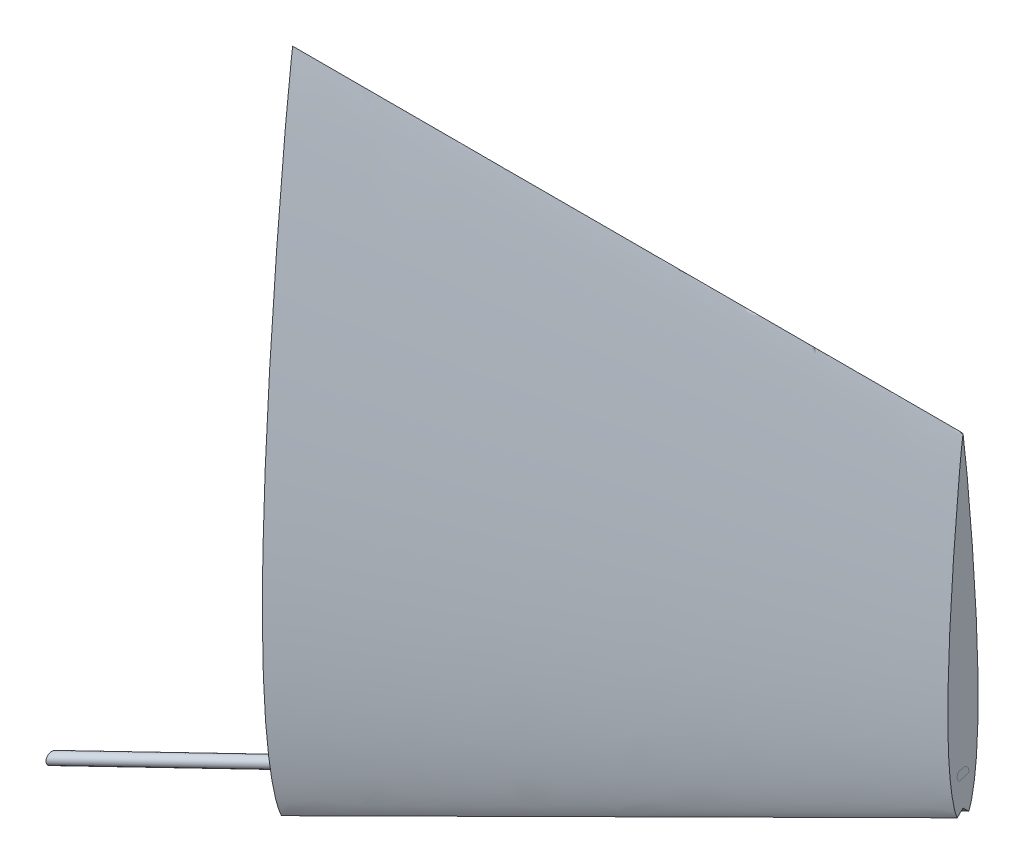
ISO-10303-21;
HEADER;
FILE_DESCRIPTION(('STEP AP214'),'2;1');
FILE_NAME('part.step','',(''),(''),'','','');
FILE_SCHEMA(('AUTOMOTIVE_DESIGN { 1 0 10303 214 1 1 1 1 }'));
ENDSEC;
DATA;
#1=APPLICATION_CONTEXT('core data for automotive mechanical design processes');
#2=APPLICATION_PROTOCOL_DEFINITION('international standard','automotive_design',2000,#1);
#3=PRODUCT_CONTEXT('',#1,'mechanical');
#4=PRODUCT('Part','Part','',(#3));
#5=PRODUCT_RELATED_PRODUCT_CATEGORY('part','',(#4));
#6=PRODUCT_DEFINITION_FORMATION('','',#4);
#7=PRODUCT_DEFINITION_CONTEXT('part definition',#1,'design');
#8=PRODUCT_DEFINITION('design','',#6,#7);
#9=PRODUCT_DEFINITION_SHAPE('','',#8);
#10=(LENGTH_UNIT() NAMED_UNIT(*) SI_UNIT(.MILLI.,.METRE.));
#11=(NAMED_UNIT(*) PLANE_ANGLE_UNIT() SI_UNIT($,.RADIAN.));
#12=(NAMED_UNIT(*) SI_UNIT($,.STERADIAN.) SOLID_ANGLE_UNIT());
#13=UNCERTAINTY_MEASURE_WITH_UNIT(LENGTH_MEASURE(1.E-05),#10,'distance_accuracy_value','');
#14=(GEOMETRIC_REPRESENTATION_CONTEXT(3) GLOBAL_UNCERTAINTY_ASSIGNED_CONTEXT((#13)) GLOBAL_UNIT_ASSIGNED_CONTEXT((#10,
#11,#12)) REPRESENTATION_CONTEXT('',''));
#15=CARTESIAN_POINT('',(0.,0.,0.));
#16=DIRECTION('',(0.,0.,1.));
#17=DIRECTION('',(1.,0.,0.));
#18=AXIS2_PLACEMENT_3D('',#15,#16,#17);
#19=CARTESIAN_POINT('',(-20.4751650397172,51.7442420315947,0.));
#20=DIRECTION('',(1.,0.,0.));
#21=DIRECTION('',(0.,0.,-1.));
#22=AXIS2_PLACEMENT_3D('',#19,#20,#21);
#23=PLANE('',#22);
#24=CARTESIAN_POINT('',(-20.4751650397172,51.7442420315947,0.));
#25=DIRECTION('',(1.,0.,0.));
#26=DIRECTION('',(0.,0.,-1.));
#27=AXIS2_PLACEMENT_3D('',#24,#25,#26);
#28=CIRCLE('',#27,0.5);
#29=CARTESIAN_POINT('',(-20.4751650397172,51.7442420315947,-0.5));
#30=VERTEX_POINT('',#29);
#31=EDGE_CURVE('E65',#30,#30,#28,.T.);
#32=ORIENTED_EDGE('',*,*,#31,.F.);
#33=EDGE_LOOP('',(#32));
#34=FACE_BOUND('',#33,.T.);
#35=ADVANCED_FACE('F59',(#34),#23,.F.);
#36=CARTESIAN_POINT('',(57.,89.3,0.));
#37=DIRECTION('',(1.,0.,0.));
#38=DIRECTION('',(0.,0.,-1.));
#39=AXIS2_PLACEMENT_3D('',#36,#37,#38);
#40=PLANE('',#39);
#41=CARTESIAN_POINT('',(57.,89.3,0.));
#42=DIRECTION('',(1.,0.,0.));
#43=DIRECTION('',(0.,0.,-1.));
#44=AXIS2_PLACEMENT_3D('',#41,#42,#43);
#45=CIRCLE('',#44,0.5);
#46=CARTESIAN_POINT('',(57.,89.3,-0.5));
#47=VERTEX_POINT('',#46);
#48=EDGE_CURVE('E12',#47,#47,#45,.T.);
#49=ORIENTED_EDGE('',*,*,#48,.T.);
#50=EDGE_LOOP('',(#49));
#51=FACE_BOUND('',#50,.T.);
#52=ADVANCED_FACE('F74',(#51),#40,.T.);
#53=CARTESIAN_POINT('',(-20.4751650397172,51.7442420315947,-0.5));
#54=CARTESIAN_POINT('',(57.,89.3,-0.5));
#55=CARTESIAN_POINT('',(-20.4751650397172,52.7442420315947,-0.5));
#56=CARTESIAN_POINT('',(57.,90.3,-0.5));
#57=CARTESIAN_POINT('',(-20.4751650397172,52.7442420315947,0.5));
#58=CARTESIAN_POINT('',(57.,90.3,0.5));
#59=CARTESIAN_POINT('',(-20.4751650397172,51.7442420315947,0.5));
#60=CARTESIAN_POINT('',(57.,89.3,0.5));
#61=CARTESIAN_POINT('',(-20.4751650397172,50.7442420315947,0.5));
#62=CARTESIAN_POINT('',(57.,88.3,0.5));
#63=CARTESIAN_POINT('',(-20.4751650397172,50.7442420315947,-0.5));
#64=CARTESIAN_POINT('',(57.,88.3,-0.5));
#65=CARTESIAN_POINT('',(-20.4751650397172,51.7442420315947,-0.5));
#66=CARTESIAN_POINT('',(57.,89.3,-0.5));
#67=(BOUNDED_SURFACE() B_SPLINE_SURFACE(3,1,((#53,#54),(#55,#56),(#57,#58),(#59,#60),(#61,#62),
(#63,#64),(#65,#66)),.UNSPECIFIED.,.T.,.F.,.F.) B_SPLINE_SURFACE_WITH_KNOTS((4,3,4),(2,2),(0.,
0.5,1.),(0.,1.),.UNSPECIFIED.) GEOMETRIC_REPRESENTATION_ITEM() RATIONAL_B_SPLINE_SURFACE(((1.,
1.),(0.333333333333333,0.333333333333333),(0.333333333333333,0.333333333333333),(1.,1.),
(0.333333333333333,0.333333333333333),(0.333333333333333,0.333333333333333),(1.,1.))) REPRESENTATION_ITEM('') SURFACE());
#68=CARTESIAN_POINT('',(57.,89.3,-0.5));
#69=CARTESIAN_POINT('',(56.1929670308363,88.9087941878292,-0.5));
#70=CARTESIAN_POINT('',(55.3859340616726,88.5175883756583,-0.5));
#71=CARTESIAN_POINT('',(53.7718681233452,87.7351767513165,-0.5));
#72=CARTESIAN_POINT('',(52.9648351541814,87.3439709391456,-0.5));
#73=CARTESIAN_POINT('',(51.350769215854,86.5615593148038,-0.5));
#74=CARTESIAN_POINT('',(50.5437362466903,86.1703535026329,-0.5));
#75=CARTESIAN_POINT('',(48.9296703083628,85.3879418782912,-0.5));
#76=CARTESIAN_POINT('',(48.1226373391991,84.9967360661203,-0.5));
#77=CARTESIAN_POINT('',(46.5085714008716,84.2143244417785,-0.5));
#78=CARTESIAN_POINT('',(45.7015384317079,83.8231186296076,-0.5));
#79=CARTESIAN_POINT('',(44.0874724933805,83.0407070052658,-0.5));
#80=CARTESIAN_POINT('',(43.2804395242168,82.6495011930949,-0.5));
#81=CARTESIAN_POINT('',(41.6663735858893,81.8670895687532,-0.5));
#82=CARTESIAN_POINT('',(40.8593406167256,81.4758837565823,-0.5));
#83=CARTESIAN_POINT('',(39.2452746783982,80.6934721322405,-0.5));
#84=CARTESIAN_POINT('',(38.4382417092344,80.3022663200696,-0.5));
#85=CARTESIAN_POINT('',(36.824175770907,79.5198546957278,-0.5));
#86=CARTESIAN_POINT('',(36.0171428017433,79.1286488835569,-0.5));
#87=CARTESIAN_POINT('',(34.4030768634158,78.3462372592151,-0.5));
#88=CARTESIAN_POINT('',(33.5960438942521,77.9550314470443,-0.5));
#89=CARTESIAN_POINT('',(31.9819779559247,77.1726198227025,-0.5));
#90=CARTESIAN_POINT('',(31.1749449867609,76.7814140105316,-0.5));
#91=CARTESIAN_POINT('',(29.5608790484335,75.9990023861898,-0.5));
#92=CARTESIAN_POINT('',(28.7538460792698,75.6077965740189,-0.5));
#93=CARTESIAN_POINT('',(27.1397801409423,74.8253849496772,-0.5));
#94=CARTESIAN_POINT('',(26.3327471717786,74.4341791375063,-0.5));
#95=CARTESIAN_POINT('',(24.7186812334512,73.6517675131645,-0.5));
#96=CARTESIAN_POINT('',(23.9116482642874,73.2605617009936,-0.5));
#97=CARTESIAN_POINT('',(22.29758232596,72.4781500766518,-0.5));
#98=CARTESIAN_POINT('',(21.4905493567963,72.0869442644809,-0.5));
#99=CARTESIAN_POINT('',(19.8764834184688,71.3045326401392,-0.5));
#100=CARTESIAN_POINT('',(19.0694504493051,70.9133268279683,-0.5));
#101=CARTESIAN_POINT('',(17.4553845109777,70.1309152036265,-0.5));
#102=CARTESIAN_POINT('',(16.648351541814,69.7397093914556,-0.5));
#103=CARTESIAN_POINT('',(15.0342856034865,68.9572977671138,-0.5));
#104=CARTESIAN_POINT('',(14.2272526343228,68.5660919549429,-0.5));
#105=CARTESIAN_POINT('',(12.6131866959953,67.7836803306012,-0.5));
#106=CARTESIAN_POINT('',(11.8061537268316,67.3924745184303,-0.5));
#107=CARTESIAN_POINT('',(10.1920877885042,66.6100628940885,-0.5));
#108=CARTESIAN_POINT('',(9.38505481934046,66.2188570819176,-0.5));
#109=CARTESIAN_POINT('',(7.77098888101302,65.4364454575758,-0.5));
#110=CARTESIAN_POINT('',(6.9639559118493,65.0452396454049,-0.5));
#111=CARTESIAN_POINT('',(5.34988997352185,64.2628280210631,-0.5));
#112=CARTESIAN_POINT('',(4.54285700435813,63.8716222088923,-0.5));
#113=CARTESIAN_POINT('',(2.92879106603068,63.0892105845505,-0.5));
#114=CARTESIAN_POINT('',(2.12175809686696,62.6980047723796,-0.5));
#115=CARTESIAN_POINT('',(0.50769215853952,61.9155931480378,-0.5));
#116=CARTESIAN_POINT('',(-0.2993408106242,61.5243873358669,-0.5));
#117=CARTESIAN_POINT('',(-1.91340674895164,60.7419757115251,-0.5));
#118=CARTESIAN_POINT('',(-2.72043971811537,60.3507698993543,-0.5));
#119=CARTESIAN_POINT('',(-4.33450565644281,59.5683582750125,-0.5));
#120=CARTESIAN_POINT('',(-5.14153862560653,59.1771524628416,-0.5));
#121=CARTESIAN_POINT('',(-6.75560456393397,58.3947408384998,-0.5));
#122=CARTESIAN_POINT('',(-7.56263753309769,58.0035350263289,-0.5));
#123=CARTESIAN_POINT('',(-9.17670347142514,57.2211234019871,-0.5));
#124=CARTESIAN_POINT('',(-9.98373644058886,56.8299175898163,-0.5));
#125=CARTESIAN_POINT('',(-11.5978023789163,56.0475059654745,-0.5));
#126=CARTESIAN_POINT('',(-12.40483534808,55.6563001533036,-0.5));
#127=CARTESIAN_POINT('',(-14.0189012864075,54.8738885289618,-0.5));
#128=CARTESIAN_POINT('',(-14.8259342555712,54.4826827167909,-0.5));
#129=CARTESIAN_POINT('',(-16.4400001938986,53.7002710924492,-0.5));
#130=CARTESIAN_POINT('',(-17.2470331630624,53.3090652802783,-0.5));
#131=CARTESIAN_POINT('',(-18.8610991013898,52.5266536559365,-0.5));
#132=CARTESIAN_POINT('',(-19.6681320705535,52.1354478437656,-0.5));
#133=CARTESIAN_POINT('',(-20.4751650397172,51.7442420315947,-0.5));
#134=B_SPLINE_CURVE_WITH_KNOTS('',3,(#68,#69,#70,#71,#72,#73,#74,#75,#76,#77,#78,#79,#80,#81,
#82,#83,#84,#85,#86,#87,#88,#89,#90,#91,#92,#93,#94,#95,#96,#97,#98,#99,#100,#101,#102,#103,
#104,#105,#106,#107,#108,#109,#110,#111,#112,#113,#114,#115,#116,#117,#118,#119,#120,#121,#122,
#123,#124,#125,#126,#127,#128,#129,#130,#131,#132,#133),.UNSPECIFIED.,.F.,.F.,(4,2,2,2,2,2,2,2,
2,2,2,2,2,2,2,2,2,2,2,2,2,2,2,2,2,2,2,2,2,2,2,2,4),(0.,2.69055715552402,5.38111431104803,
8.07167146657204,10.7622286220961,13.4527857776201,16.1433429331441,18.8339000886681,
21.5244572441921,24.2150143997161,26.9055715552401,29.5961287107641,32.2866858662882,
34.9772430218122,37.6678001773362,40.3583573328602,43.0489144883842,45.7394716439082,
48.4300287994323,51.1205859549563,53.8111431104803,56.5017002660043,59.1922574215283,
61.8828145770523,64.5733717325763,67.2639288881003,69.9544860436244,72.6450431991484,
75.3356003546724,78.0261575101964,80.7167146657204,83.4072718212444,86.0978289767685),.UNSPECIFIED.);
#135=EDGE_CURVE('BSEAM71',#47,#30,#134,.T.);
#136=ORIENTED_EDGE('',*,*,#48,.F.);
#137=ORIENTED_EDGE('',*,*,#31,.T.);
#138=ORIENTED_EDGE('',*,*,#135,.T.);
#139=ORIENTED_EDGE('',*,*,#135,.F.);
#140=EDGE_LOOP('',(#136,#138,#137,#139));
#141=FACE_BOUND('',#140,.T.);
#142=ADVANCED_FACE('F71',(#141),#67,.T.);
#143=CLOSED_SHELL('',(#35,#52,#142));
#144=MANIFOLD_SOLID_BREP('B2',#143);
#145=CARTESIAN_POINT('',(57.,114.4,0.));
#146=CARTESIAN_POINT('',(0.,114.4,0.));
#147=CARTESIAN_POINT('',(57.,114.4,-0.00182095810749763));
#148=CARTESIAN_POINT('',(0.,114.4,-0.00364191621499526));
#149=CARTESIAN_POINT('',(57.,114.352907672617,-0.00546220916385912));
#150=CARTESIAN_POINT('',(0.,114.305815345234,-0.0109244183277182));
#151=CARTESIAN_POINT('',(57.,114.32002966172,-0.0109070616915182));
#152=CARTESIAN_POINT('',(0.,114.240059323441,-0.0218141233830365));
#153=CARTESIAN_POINT('',(57.,114.249222738711,-0.0198785714299646));
#154=CARTESIAN_POINT('',(0.,114.098445477423,-0.0397571428599293));
#155=CARTESIAN_POINT('',(57.,114.156548337744,-0.032132456041945));
#156=CARTESIAN_POINT('',(0.,113.913096675488,-0.0642649120838899));
#157=CARTESIAN_POINT('',(57.,114.034213823481,-0.0474417351200506));
#158=CARTESIAN_POINT('',(0.,113.668427646962,-0.0948834702401012));
#159=CARTESIAN_POINT('',(57.,113.886541749933,-0.0656072474393022));
#160=CARTESIAN_POINT('',(0.,113.373083499866,-0.131214494878604));
#161=CARTESIAN_POINT('',(57.,113.370012426993,-0.127548617429597));
#162=CARTESIAN_POINT('',(0.,112.340024853985,-0.255097234859193));
#163=CARTESIAN_POINT('',(57.,112.137163028017,-0.259027461460315));
#164=CARTESIAN_POINT('',(0.,109.874326056035,-0.51805492292063));
#165=CARTESIAN_POINT('',(57.,110.501004902275,-0.411740073326686));
#166=CARTESIAN_POINT('',(0.,106.60200980455,-0.823480146653373));
#167=CARTESIAN_POINT('',(57.,108.197187000479,-0.60964155845022));
#168=CARTESIAN_POINT('',(0.,101.994374000957,-1.21928311690044));
#169=CARTESIAN_POINT('',(57.,105.44956023543,-0.82314706743673));
#170=CARTESIAN_POINT('',(0.,96.4991204708607,-1.64629413487346));
#171=CARTESIAN_POINT('',(57.,101.925918142368,-1.05329602538316));
#172=CARTESIAN_POINT('',(0.,89.4518362847364,-2.10659205076633));
#173=CARTESIAN_POINT('',(57.0000000000001,98.2774944583724,-1.22854383866665));
#174=CARTESIAN_POINT('',(0.,82.1549889167448,-2.45708767733329));
#175=CARTESIAN_POINT('',(57.,95.5458702597783,-1.29200246249632));
#176=CARTESIAN_POINT('',(0.,76.6917405195566,-2.58400492499264));
#177=CARTESIAN_POINT('',(57.,93.7843198333664,-1.28990739427786));
#178=CARTESIAN_POINT('',(0.,73.1686396667328,-2.57981478855572));
#179=CARTESIAN_POINT('',(57.,92.7064529548784,-1.27556105945408));
#180=CARTESIAN_POINT('',(0.,71.0129059097568,-2.55112211890817));
#181=CARTESIAN_POINT('',(57.,91.4434168803456,-1.23757411909588));
#182=CARTESIAN_POINT('',(0.,68.4868337606911,-2.47514823819176));
#183=CARTESIAN_POINT('',(57.,89.8610871222189,-1.14403607707087));
#184=CARTESIAN_POINT('',(0.,65.3221742444376,-2.28807215414174));
#185=CARTESIAN_POINT('',(56.9999999999999,88.6339594379661,-1.01587816182833));
#186=CARTESIAN_POINT('',(0.,62.8679188759322,-2.03175632365666));
#187=CARTESIAN_POINT('',(57.,87.7322213407688,-0.870007471666012));
#188=CARTESIAN_POINT('',(0.,61.0644426815377,-1.74001494333202));
#189=CARTESIAN_POINT('',(57.,87.291174629283,-0.784346378199465));
#190=CARTESIAN_POINT('',(0.,60.1823492585658,-1.56869275639893));
#191=CARTESIAN_POINT('',(57.,86.9042703456185,-0.693141039222563));
#192=CARTESIAN_POINT('',(0.,59.4085406912369,-1.38628207844513));
#193=CARTESIAN_POINT('',(57.,86.5733208454091,-0.59333455424871));
#194=CARTESIAN_POINT('',(0.,58.746641690818,-1.18666910849742));
#195=CARTESIAN_POINT('',(57.,86.2785415535032,-0.4748173297146));
#196=CARTESIAN_POINT('',(0.,58.1570831070064,-0.9496346594292));
#197=CARTESIAN_POINT('',(57.,86.0648861911922,-0.349405025256917));
#198=CARTESIAN_POINT('',(0.,57.7297723823844,-0.698810050513834));
#199=CARTESIAN_POINT('',(57.,85.9154971726472,-0.217553009946631));
#200=CARTESIAN_POINT('',(0.,57.4309943452943,-0.435106019893263));
#201=CARTESIAN_POINT('',(57.,85.8398706402099,-0.125468872465283));
#202=CARTESIAN_POINT('',(0.,57.2797412804197,-0.250937744930566));
#203=CARTESIAN_POINT('',(57.,85.8046969145248,-0.0466468105661051));
#204=CARTESIAN_POINT('',(0.,57.2093938290495,-0.0932936211322103));
#205=CARTESIAN_POINT('',(57.,85.7984647875065,0.));
#206=CARTESIAN_POINT('',(0.,57.196929575013,0.));
#207=CARTESIAN_POINT('',(57.,85.8046969145248,0.0466468105660989));
#208=CARTESIAN_POINT('',(0.,57.2093938290495,0.0932936211321978));
#209=CARTESIAN_POINT('',(57.,85.8398706402099,0.125468872465298));
#210=CARTESIAN_POINT('',(0.,57.2797412804197,0.250937744930596));
#211=CARTESIAN_POINT('',(57.,85.9154971726472,0.217553009946615));
#212=CARTESIAN_POINT('',(0.,57.4309943452942,0.43510601989323));
#213=CARTESIAN_POINT('',(57.,86.0648861911922,0.349405025256929));
#214=CARTESIAN_POINT('',(0.,57.7297723823844,0.698810050513857));
#215=CARTESIAN_POINT('',(57.,86.2785415535032,0.474817329714599));
#216=CARTESIAN_POINT('',(0.,58.1570831070064,0.949634659429199));
#217=CARTESIAN_POINT('',(57.,86.5733208454091,0.593334554248706));
#218=CARTESIAN_POINT('',(0.,58.746641690818,1.18666910849741));
#219=CARTESIAN_POINT('',(57.,86.9042703456185,0.693141039222563));
#220=CARTESIAN_POINT('',(0.,59.4085406912369,1.38628207844513));
#221=CARTESIAN_POINT('',(57.,87.2911746292829,0.784346378199468));
#222=CARTESIAN_POINT('',(0.,60.1823492585659,1.56869275639894));
#223=CARTESIAN_POINT('',(57.,87.7322213407688,0.870007471666016));
#224=CARTESIAN_POINT('',(0.,61.0644426815377,1.74001494333203));
#225=CARTESIAN_POINT('',(57.,88.6339594379661,1.01587816182832));
#226=CARTESIAN_POINT('',(0.,62.867918875932,2.03175632365664));
#227=CARTESIAN_POINT('',(57.,89.8610871222189,1.14403607707087));
#228=CARTESIAN_POINT('',(0.,65.3221742444377,2.28807215414174));
#229=CARTESIAN_POINT('',(57.,91.4434168803456,1.23757411909588));
#230=CARTESIAN_POINT('',(0.,68.4868337606911,2.47514823819176));
#231=CARTESIAN_POINT('',(57.,92.7064529548784,1.27556105945408));
#232=CARTESIAN_POINT('',(0.,71.0129059097568,2.55112211890816));
#233=CARTESIAN_POINT('',(57.,93.7843198333664,1.28990739427786));
#234=CARTESIAN_POINT('',(0.,73.1686396667329,2.57981478855573));
#235=CARTESIAN_POINT('',(57.,95.5458702597782,1.29200246249631));
#236=CARTESIAN_POINT('',(0.,76.6917405195565,2.58400492499263));
#237=CARTESIAN_POINT('',(57.,98.2774944583724,1.22854383866664));
#238=CARTESIAN_POINT('',(0.,82.1549889167447,2.45708767733329));
#239=CARTESIAN_POINT('',(57.,101.925918142368,1.05329602538317));
#240=CARTESIAN_POINT('',(0.,89.4518362847363,2.10659205076633));
#241=CARTESIAN_POINT('',(57.,105.44956023543,0.823147067436728));
#242=CARTESIAN_POINT('',(0.,96.4991204708606,1.64629413487346));
#243=CARTESIAN_POINT('',(57.,108.197187000479,0.609641558450223));
#244=CARTESIAN_POINT('',(0.,101.994374000957,1.21928311690045));
#245=CARTESIAN_POINT('',(57.,110.501004902275,0.411740073326685));
#246=CARTESIAN_POINT('',(0.,106.60200980455,0.823480146653369));
#247=CARTESIAN_POINT('',(57.,112.137163028017,0.259027461460316));
#248=CARTESIAN_POINT('',(0.,109.874326056034,0.518054922920633));
#249=CARTESIAN_POINT('',(57.,113.370012426993,0.127548617429595));
#250=CARTESIAN_POINT('',(0.,112.340024853985,0.25509723485919));
#251=CARTESIAN_POINT('',(57.,113.886541749933,0.0656072474393026));
#252=CARTESIAN_POINT('',(0.,113.373083499866,0.131214494878605));
#253=CARTESIAN_POINT('',(57.,114.034213823481,0.0474417351200502));
#254=CARTESIAN_POINT('',(0.,113.668427646962,0.0948834702401005));
#255=CARTESIAN_POINT('',(57.,114.156548337744,0.0321324560419456));
#256=CARTESIAN_POINT('',(0.,113.913096675488,0.0642649120838911));
#257=CARTESIAN_POINT('',(57.,114.249222738711,0.0198785714299638));
#258=CARTESIAN_POINT('',(0.,114.098445477423,0.0397571428599277));
#259=CARTESIAN_POINT('',(57.,114.32002966172,0.0109070616915188));
#260=CARTESIAN_POINT('',(0.,114.240059323441,0.0218141233830376));
#261=CARTESIAN_POINT('',(57.,114.352907672617,0.00546220916385825));
#262=CARTESIAN_POINT('',(0.,114.305815345234,0.0109244183277165));
#263=CARTESIAN_POINT('',(57.,114.4,0.00182095810749828));
#264=CARTESIAN_POINT('',(0.,114.4,0.00364191621499655));
#265=CARTESIAN_POINT('',(57.,114.4,0.));
#266=CARTESIAN_POINT('',(0.,114.4,0.));
#267=B_SPLINE_SURFACE_WITH_KNOTS('',3,1,((#145,#146),(#147,#148),(#149,#150),(#151,#152),(#153,
#154),(#155,#156),(#157,#158),(#159,#160),(#161,#162),(#163,#164),(#165,#166),(#167,#168),(#169,
#170),(#171,#172),(#173,#174),(#175,#176),(#177,#178),(#179,#180),(#181,#182),(#183,#184),(#185,
#186),(#187,#188),(#189,#190),(#191,#192),(#193,#194),(#195,#196),(#197,#198),(#199,#200),(#201,
#202),(#203,#204),(#205,#206),(#207,#208),(#209,#210),(#211,#212),(#213,#214),(#215,#216),(#217,
#218),(#219,#220),(#221,#222),(#223,#224),(#225,#226),(#227,#228),(#229,#230),(#231,#232),(#233,
#234),(#235,#236),(#237,#238),(#239,#240),(#241,#242),(#243,#244),(#245,#246),(#247,#248),(#249,
#250),(#251,#252),(#253,#254),(#255,#256),(#257,#258),(#259,#260),(#261,#262),(#263,#264),(#265,
#266)),.UNSPECIFIED.,.T.,.F.,.F.,(4,1,1,1,1,1,1,1,1,1,1,1,1,1,1,1,1,1,1,1,1,1,1,1,1,1,1,1,1,1,1,
1,1,1,1,1,1,1,1,1,1,1,1,1,1,1,1,1,1,1,1,1,1,1,1,1,1,1,4),(2,2),(0.,0.000711185839145978,
0.00142211189669672,0.00213325230730554,0.00425158120835245,0.00636919832710714,
0.00848752581630519,0.0119730784810976,0.0333165732602392,0.072750532853801,0.0971333248630511,
0.153150736130299,0.215572756141474,0.280129489501461,0.342436877180773,0.35716003719228,
0.371419982611637,0.398301185339692,0.422640862362832,0.453555830037826,0.462206438132531,
0.469975829256052,0.476836911130722,0.482800105251618,0.487877314409996,0.493276037135274,
0.495568649395588,0.498179926351265,0.499405098860122,0.5,0.500594901139878,0.501820073648734,
0.504431350604412,0.506723962864726,0.512122685590004,0.517199894748382,0.523163088869278,
0.530024170743948,0.537793561867469,0.546444169962174,0.577359137637168,0.601698814660308,
0.628580017388363,0.64283996280772,0.657563122819227,0.719870510498539,0.784427243858526,
0.846849263869701,0.902866675136949,0.927249467146199,0.966683426739761,0.988026921518902,
0.991512474183695,0.993630801672893,0.995748418791648,0.997866747692694,0.998577888103303,
0.999288814160854,1.),(0.,1.),.UNSPECIFIED.);
#268=CARTESIAN_POINT('',(-2.06986420254256E-09,58.2106451711589,-0.958846343718187));
#269=CARTESIAN_POINT('',(0.539355628737673,58.476585430405,-0.954356445363692));
#270=CARTESIAN_POINT('',(1.07871125865156,58.7425256914068,-0.94986654364945));
#271=CARTESIAN_POINT('',(3.77548940303166,60.0722270066488,-0.927417017812049));
#272=CARTESIAN_POINT('',(5.9329119019299,61.135988091588,-0.909457341890301));
#273=CARTESIAN_POINT('',(12.4051793211183,64.3272715004954,-0.855578130418875));
#274=CARTESIAN_POINT('',(16.7200241639021,66.4547939785533,-0.819658411163012));
#275=CARTESIAN_POINT('',(25.349713559831,70.7098395099068,-0.747818251203469));
#276=CARTESIAN_POINT('',(29.6645581129761,72.8373625632025,-0.71189781049979));
#277=CARTESIAN_POINT('',(36.1368245978872,76.0286478280898,-0.658016298874898));
#278=CARTESIAN_POINT('',(38.2942467020564,77.0924096972095,-0.640055653238372));
#279=CARTESIAN_POINT('',(42.7564766730521,79.292605435925,-0.602906985292775));
#280=CARTESIAN_POINT('',(45.0612845293319,80.4290393264703,-0.583718936912403));
#281=CARTESIAN_POINT('',(49.6709001610447,82.7019076292547,-0.545342279307926));
#282=CARTESIAN_POINT('',(51.9757079364778,83.8383420414937,-0.526153670083787));
#283=CARTESIAN_POINT('',(55.1870103923448,85.4217434525558,-0.499417517294044));
#284=CARTESIAN_POINT('',(56.0935052070656,85.8687101846345,-0.491870305572043));
#285=CARTESIAN_POINT('',(56.9999999944368,86.3156769710398,-0.484323026263469));
#286=B_SPLINE_CURVE_WITH_KNOTS('',3,(#268,#269,#270,#271,#272,#273,#274,#275,#276,#277,#278,
#279,#280,#281,#282,#283,#284,#285),.UNSPECIFIED.,.F.,.F.,(4,2,2,2,2,2,2,2,4),(0.,
1.8041174835443,9.0205874177215,23.4535272860759,37.8864671544304,45.1029370886076,
52.8124056052012,60.5218746089441,63.5540556097997),.UNSPECIFIED.);
#287=CARTESIAN_POINT('',(0.,58.2106451766361,-0.95884634878765));
#288=VERTEX_POINT('',#287);
#289=CARTESIAN_POINT('',(57.,86.315676970247,-0.484323029753023));
#290=VERTEX_POINT('',#289);
#291=EDGE_CURVE('E149',#288,#290,#286,.T.);
#292=CARTESIAN_POINT('',(0.,114.4,0.));
#293=CARTESIAN_POINT('',(0.,114.4,-0.00364191621499526));
#294=CARTESIAN_POINT('',(0.,114.305815345234,-0.0109244183277182));
#295=CARTESIAN_POINT('',(0.,114.240059323441,-0.0218141233830365));
#296=CARTESIAN_POINT('',(0.,114.098445477423,-0.0397571428599293));
#297=CARTESIAN_POINT('',(0.,113.913096675488,-0.0642649120838899));
#298=CARTESIAN_POINT('',(0.,113.668427646962,-0.0948834702401012));
#299=CARTESIAN_POINT('',(0.,113.373083499866,-0.131214494878604));
#300=CARTESIAN_POINT('',(0.,112.340024853985,-0.255097234859193));
#301=CARTESIAN_POINT('',(0.,109.874326056035,-0.51805492292063));
#302=CARTESIAN_POINT('',(0.,106.60200980455,-0.823480146653373));
#303=CARTESIAN_POINT('',(0.,101.994374000957,-1.21928311690044));
#304=CARTESIAN_POINT('',(0.,96.4991204708607,-1.64629413487346));
#305=CARTESIAN_POINT('',(0.,89.4518362847364,-2.10659205076633));
#306=CARTESIAN_POINT('',(0.,82.1549889167448,-2.45708767733329));
#307=CARTESIAN_POINT('',(0.,76.6917405195566,-2.58400492499264));
#308=CARTESIAN_POINT('',(0.,73.1686396667328,-2.57981478855572));
#309=CARTESIAN_POINT('',(0.,71.0129059097568,-2.55112211890817));
#310=CARTESIAN_POINT('',(0.,68.4868337606911,-2.47514823819176));
#311=CARTESIAN_POINT('',(0.,65.3221742444376,-2.28807215414174));
#312=CARTESIAN_POINT('',(0.,62.8679188759322,-2.03175632365666));
#313=CARTESIAN_POINT('',(0.,61.0644426815377,-1.74001494333202));
#314=CARTESIAN_POINT('',(0.,60.1823492585658,-1.56869275639893));
#315=CARTESIAN_POINT('',(0.,59.4085406912369,-1.38628207844513));
#316=CARTESIAN_POINT('',(0.,58.746641690818,-1.18666910849742));
#317=CARTESIAN_POINT('',(0.,58.1570831070064,-0.9496346594292));
#318=CARTESIAN_POINT('',(0.,57.7297723823844,-0.698810050513834));
#319=CARTESIAN_POINT('',(0.,57.4309943452943,-0.435106019893263));
#320=CARTESIAN_POINT('',(0.,57.2797412804197,-0.250937744930566));
#321=CARTESIAN_POINT('',(0.,57.2093938290495,-0.0932936211322103));
#322=CARTESIAN_POINT('',(0.,57.196929575013,0.));
#323=CARTESIAN_POINT('',(0.,57.2093938290495,0.0932936211321978));
#324=CARTESIAN_POINT('',(0.,57.2797412804197,0.250937744930596));
#325=CARTESIAN_POINT('',(0.,57.4309943452942,0.43510601989323));
#326=CARTESIAN_POINT('',(0.,57.7297723823844,0.698810050513857));
#327=CARTESIAN_POINT('',(0.,58.1570831070064,0.949634659429199));
#328=CARTESIAN_POINT('',(0.,58.746641690818,1.18666910849741));
#329=CARTESIAN_POINT('',(0.,59.4085406912369,1.38628207844513));
#330=CARTESIAN_POINT('',(0.,60.1823492585659,1.56869275639894));
#331=CARTESIAN_POINT('',(0.,61.0644426815377,1.74001494333203));
#332=CARTESIAN_POINT('',(0.,62.867918875932,2.03175632365664));
#333=CARTESIAN_POINT('',(0.,65.3221742444377,2.28807215414174));
#334=CARTESIAN_POINT('',(0.,68.4868337606911,2.47514823819176));
#335=CARTESIAN_POINT('',(0.,71.0129059097568,2.55112211890816));
#336=CARTESIAN_POINT('',(0.,73.1686396667329,2.57981478855573));
#337=CARTESIAN_POINT('',(0.,76.6917405195565,2.58400492499263));
#338=CARTESIAN_POINT('',(0.,82.1549889167447,2.45708767733329));
#339=CARTESIAN_POINT('',(0.,89.4518362847363,2.10659205076633));
#340=CARTESIAN_POINT('',(0.,96.4991204708606,1.64629413487346));
#341=CARTESIAN_POINT('',(0.,101.994374000957,1.21928311690045));
#342=CARTESIAN_POINT('',(0.,106.60200980455,0.823480146653369));
#343=CARTESIAN_POINT('',(0.,109.874326056034,0.518054922920633));
#344=CARTESIAN_POINT('',(0.,112.340024853985,0.25509723485919));
#345=CARTESIAN_POINT('',(0.,113.373083499866,0.131214494878605));
#346=CARTESIAN_POINT('',(0.,113.668427646962,0.0948834702401005));
#347=CARTESIAN_POINT('',(0.,113.913096675488,0.0642649120838911));
#348=CARTESIAN_POINT('',(0.,114.098445477423,0.0397571428599277));
#349=CARTESIAN_POINT('',(0.,114.240059323441,0.0218141233830376));
#350=CARTESIAN_POINT('',(0.,114.305815345234,0.0109244183277165));
#351=CARTESIAN_POINT('',(0.,114.4,0.00364191621499655));
#352=CARTESIAN_POINT('',(0.,114.4,0.));
#353=B_SPLINE_CURVE_WITH_KNOTS('',3,(#292,#293,#294,#295,#296,#297,#298,#299,#300,#301,#302,
#303,#304,#305,#306,#307,#308,#309,#310,#311,#312,#313,#314,#315,#316,#317,#318,#319,#320,#321,
#322,#323,#324,#325,#326,#327,#328,#329,#330,#331,#332,#333,#334,#335,#336,#337,#338,#339,#340,
#341,#342,#343,#344,#345,#346,#347,#348,#349,#350,#351,#352),.UNSPECIFIED.,.T.,.F.,(4,1,1,1,1,1,
1,1,1,1,1,1,1,1,1,1,1,1,1,1,1,1,1,1,1,1,1,1,1,1,1,1,1,1,1,1,1,1,1,1,1,1,1,1,1,1,1,1,1,1,1,1,1,1,
1,1,1,1,4),(0.,0.000711185839145978,0.00142211189669672,0.00213325230730554,0.00425158120835245,
0.00636919832710714,0.00848752581630519,0.0119730784810976,0.0333165732602392,0.072750532853801,
0.0971333248630511,0.153150736130299,0.215572756141474,0.280129489501461,0.342436877180773,
0.35716003719228,0.371419982611637,0.398301185339692,0.422640862362832,0.453555830037826,
0.462206438132531,0.469975829256052,0.476836911130722,0.482800105251618,0.487877314409996,
0.493276037135274,0.495568649395588,0.498179926351265,0.499405098860122,0.5,0.500594901139878,
0.501820073648734,0.504431350604412,0.506723962864726,0.512122685590004,0.517199894748382,
0.523163088869278,0.530024170743948,0.537793561867469,0.546444169962174,0.577359137637168,
0.601698814660308,0.628580017388363,0.64283996280772,0.657563122819227,0.719870510498539,
0.784427243858526,0.846849263869701,0.902866675136949,0.927249467146199,0.966683426739761,
0.988026921518902,0.991512474183695,0.993630801672893,0.995748418791648,0.997866747692694,
0.998577888103303,0.999288814160854,1.),.UNSPECIFIED.);
#354=CARTESIAN_POINT('',(0.,58.2106451676679,0.958846339819422));
#355=VERTEX_POINT('',#354);
#356=EDGE_CURVE('E193',#355,#288,#353,.T.);
#357=CARTESIAN_POINT('',(56.9999999977462,86.3156769642935,0.484323024222515));
#358=CARTESIAN_POINT('',(56.7231880265369,86.1791888609528,0.486627702093045));
#359=CARTESIAN_POINT('',(56.4463760531049,86.042700762006,0.488932373217644));
#360=CARTESIAN_POINT('',(55.0623161748733,85.3602602891831,0.500455696644033));
#361=CARTESIAN_POINT('',(53.9550682368581,84.8143079810406,0.509674252355996));
#362=CARTESIAN_POINT('',(50.6333243181172,83.1764512647208,0.537329669273227));
#363=CARTESIAN_POINT('',(48.4188282326962,82.0845470646517,0.555766280259836));
#364=CARTESIAN_POINT('',(43.9898358644899,79.9007390564521,0.592639008458876));
#365=CARTESIAN_POINT('',(41.7753395817045,78.8088352483216,0.611075125671306));
#366=CARTESIAN_POINT('',(37.3463468638863,76.6250279345092,0.647946985462358));
#367=CARTESIAN_POINT('',(35.1318504288534,75.5331244288273,0.666382728040979));
#368=CARTESIAN_POINT('',(28.4883609496634,72.2574142575868,0.72168952513078));
#369=CARTESIAN_POINT('',(24.0593677314149,70.073607937833,0.758560148995897));
#370=CARTESIAN_POINT('',(16.5373405146037,66.3647181250115,0.821179141337085));
#371=CARTESIAN_POINT('',(13.444306591446,64.839634482159,0.846927696053859));
#372=CARTESIAN_POINT('',(7.25823850376603,61.789467350998,0.898424533891962));
#373=CARTESIAN_POINT('',(4.16520433924387,60.2643838626894,0.924172817013281));
#374=CARTESIAN_POINT('',(0.71478008699755,58.5630820305551,0.952896113311339));
#375=CARTESIAN_POINT('',(0.357390041230047,58.386863603387,0.955871230158257));
#376=CARTESIAN_POINT('',(-5.08570252577556E-09,58.2106451773079,0.958846345650579));
#377=B_SPLINE_CURVE_WITH_KNOTS('',3,(#357,#358,#359,#360,#361,#362,#363,#364,#365,#366,#367,
#368,#369,#370,#371,#372,#373,#374,#375,#376),.UNSPECIFIED.,.F.,.F.,(4,2,2,2,2,2,2,2,2,4),(0.,
0.925922584067193,4.62961292033591,12.0369935928734,19.4443742654108,26.8517549379482,
41.6665162830231,52.0125598553332,62.3586038659523,63.5540556097998),.UNSPECIFIED.);
#378=CARTESIAN_POINT('',(57.,86.315676970247,0.484323029753029));
#379=VERTEX_POINT('',#378);
#380=EDGE_CURVE('E128',#379,#355,#377,.T.);
#381=CARTESIAN_POINT('',(57.,114.4,0.));
#382=CARTESIAN_POINT('',(57.,114.4,-0.00182095810749763));
#383=CARTESIAN_POINT('',(57.,114.352907672617,-0.00546220916385912));
#384=CARTESIAN_POINT('',(57.,114.32002966172,-0.0109070616915182));
#385=CARTESIAN_POINT('',(57.,114.249222738711,-0.0198785714299646));
#386=CARTESIAN_POINT('',(57.,114.156548337744,-0.032132456041945));
#387=CARTESIAN_POINT('',(57.,114.034213823481,-0.0474417351200506));
#388=CARTESIAN_POINT('',(57.,113.886541749933,-0.0656072474393022));
#389=CARTESIAN_POINT('',(57.,113.370012426993,-0.127548617429597));
#390=CARTESIAN_POINT('',(57.,112.137163028017,-0.259027461460315));
#391=CARTESIAN_POINT('',(57.,110.501004902275,-0.411740073326686));
#392=CARTESIAN_POINT('',(57.,108.197187000479,-0.60964155845022));
#393=CARTESIAN_POINT('',(57.,105.44956023543,-0.82314706743673));
#394=CARTESIAN_POINT('',(57.,101.925918142368,-1.05329602538316));
#395=CARTESIAN_POINT('',(57.0000000000001,98.2774944583724,-1.22854383866665));
#396=CARTESIAN_POINT('',(57.,95.5458702597783,-1.29200246249632));
#397=CARTESIAN_POINT('',(57.,93.7843198333664,-1.28990739427786));
#398=CARTESIAN_POINT('',(57.,92.7064529548784,-1.27556105945408));
#399=CARTESIAN_POINT('',(57.,91.4434168803456,-1.23757411909588));
#400=CARTESIAN_POINT('',(57.,89.8610871222189,-1.14403607707087));
#401=CARTESIAN_POINT('',(56.9999999999999,88.6339594379661,-1.01587816182833));
#402=CARTESIAN_POINT('',(57.,87.7322213407688,-0.870007471666012));
#403=CARTESIAN_POINT('',(57.,87.291174629283,-0.784346378199465));
#404=CARTESIAN_POINT('',(57.,86.9042703456185,-0.693141039222563));
#405=CARTESIAN_POINT('',(57.,86.5733208454091,-0.59333455424871));
#406=CARTESIAN_POINT('',(57.,86.2785415535032,-0.4748173297146));
#407=CARTESIAN_POINT('',(57.,86.0648861911922,-0.349405025256917));
#408=CARTESIAN_POINT('',(57.,85.9154971726472,-0.217553009946631));
#409=CARTESIAN_POINT('',(57.,85.8398706402099,-0.125468872465283));
#410=CARTESIAN_POINT('',(57.,85.8046969145248,-0.0466468105661051));
#411=CARTESIAN_POINT('',(57.,85.7984647875065,0.));
#412=CARTESIAN_POINT('',(57.,85.8046969145248,0.0466468105660989));
#413=CARTESIAN_POINT('',(57.,85.8398706402099,0.125468872465298));
#414=CARTESIAN_POINT('',(57.,85.9154971726472,0.217553009946615));
#415=CARTESIAN_POINT('',(57.,86.0648861911922,0.349405025256929));
#416=CARTESIAN_POINT('',(57.,86.2785415535032,0.474817329714599));
#417=CARTESIAN_POINT('',(57.,86.5733208454091,0.593334554248706));
#418=CARTESIAN_POINT('',(57.,86.9042703456185,0.693141039222563));
#419=CARTESIAN_POINT('',(57.,87.2911746292829,0.784346378199468));
#420=CARTESIAN_POINT('',(57.,87.7322213407688,0.870007471666016));
#421=CARTESIAN_POINT('',(57.,88.6339594379661,1.01587816182832));
#422=CARTESIAN_POINT('',(57.,89.8610871222189,1.14403607707087));
#423=CARTESIAN_POINT('',(57.,91.4434168803456,1.23757411909588));
#424=CARTESIAN_POINT('',(57.,92.7064529548784,1.27556105945408));
#425=CARTESIAN_POINT('',(57.,93.7843198333664,1.28990739427786));
#426=CARTESIAN_POINT('',(57.,95.5458702597782,1.29200246249631));
#427=CARTESIAN_POINT('',(57.,98.2774944583724,1.22854383866664));
#428=CARTESIAN_POINT('',(57.,101.925918142368,1.05329602538317));
#429=CARTESIAN_POINT('',(57.,105.44956023543,0.823147067436728));
#430=CARTESIAN_POINT('',(57.,108.197187000479,0.609641558450223));
#431=CARTESIAN_POINT('',(57.,110.501004902275,0.411740073326685));
#432=CARTESIAN_POINT('',(57.,112.137163028017,0.259027461460316));
#433=CARTESIAN_POINT('',(57.,113.370012426993,0.127548617429595));
#434=CARTESIAN_POINT('',(57.,113.886541749933,0.0656072474393026));
#435=CARTESIAN_POINT('',(57.,114.034213823481,0.0474417351200502));
#436=CARTESIAN_POINT('',(57.,114.156548337744,0.0321324560419456));
#437=CARTESIAN_POINT('',(57.,114.249222738711,0.0198785714299638));
#438=CARTESIAN_POINT('',(57.,114.32002966172,0.0109070616915188));
#439=CARTESIAN_POINT('',(57.,114.352907672617,0.00546220916385825));
#440=CARTESIAN_POINT('',(57.,114.4,0.00182095810749828));
#441=CARTESIAN_POINT('',(57.,114.4,0.));
#442=B_SPLINE_CURVE_WITH_KNOTS('',3,(#381,#382,#383,#384,#385,#386,#387,#388,#389,#390,#391,
#392,#393,#394,#395,#396,#397,#398,#399,#400,#401,#402,#403,#404,#405,#406,#407,#408,#409,#410,
#411,#412,#413,#414,#415,#416,#417,#418,#419,#420,#421,#422,#423,#424,#425,#426,#427,#428,#429,
#430,#431,#432,#433,#434,#435,#436,#437,#438,#439,#440,#441),.UNSPECIFIED.,.T.,.F.,(4,1,1,1,1,1,
1,1,1,1,1,1,1,1,1,1,1,1,1,1,1,1,1,1,1,1,1,1,1,1,1,1,1,1,1,1,1,1,1,1,1,1,1,1,1,1,1,1,1,1,1,1,1,1,
1,1,1,1,4),(0.,0.000711185839145978,0.00142211189669672,0.00213325230730554,0.00425158120835245,
0.00636919832710714,0.00848752581630519,0.0119730784810976,0.0333165732602392,0.072750532853801,
0.0971333248630511,0.153150736130299,0.215572756141474,0.280129489501461,0.342436877180773,
0.35716003719228,0.371419982611637,0.398301185339692,0.422640862362832,0.453555830037826,
0.462206438132531,0.469975829256052,0.476836911130722,0.482800105251618,0.487877314409996,
0.493276037135274,0.495568649395588,0.498179926351265,0.499405098860122,0.5,0.500594901139878,
0.501820073648734,0.504431350604412,0.506723962864726,0.512122685590004,0.517199894748382,
0.523163088869278,0.530024170743948,0.537793561867469,0.546444169962174,0.577359137637168,
0.601698814660308,0.628580017388363,0.64283996280772,0.657563122819227,0.719870510498539,
0.784427243858526,0.846849263869701,0.902866675136949,0.927249467146199,0.966683426739761,
0.988026921518902,0.991512474183695,0.993630801672893,0.995748418791648,0.997866747692694,
0.998577888103303,0.999288814160854,1.),.UNSPECIFIED.);
#443=EDGE_CURVE('E159',#379,#290,#442,.T.);
#444=ORIENTED_EDGE('',*,*,#291,.F.);
#445=ORIENTED_EDGE('',*,*,#356,.F.);
#446=ORIENTED_EDGE('',*,*,#380,.F.);
#447=ORIENTED_EDGE('',*,*,#443,.T.);
#448=EDGE_LOOP('',(#444,#445,#446,#447));
#449=FACE_BOUND('',#448,.T.);
#450=ADVANCED_FACE('F113',(#449),#267,.T.);
#451=CARTESIAN_POINT('',(57.,85.8,0.));
#452=DIRECTION('',(1.,0.,0.));
#453=DIRECTION('',(0.,0.,-1.));
#454=AXIS2_PLACEMENT_3D('',#451,#452,#453);
#455=PLANE('',#454);
#456=DIRECTION('',(0.,0.707106781186544,0.707106781186551));
#457=VECTOR('',#456,1.);
#458=CARTESIAN_POINT('',(57.,83.6443459229774,-3.15565407702272));
#459=LINE('',#458,#457);
#460=CARTESIAN_POINT('',(57.,86.8,0.));
#461=VERTEX_POINT('',#460);
#462=EDGE_CURVE('E145',#290,#461,#459,.T.);
#463=ORIENTED_EDGE('',*,*,#462,.F.);
#464=ORIENTED_EDGE('',*,*,#443,.F.);
#465=DIRECTION('',(0.,-0.707106781186548,0.707106781186547));
#466=VECTOR('',#465,1.);
#467=CARTESIAN_POINT('',(57.,86.8,0.));
#468=LINE('',#467,#466);
#469=EDGE_CURVE('E156',#461,#379,#468,.T.);
#470=ORIENTED_EDGE('',*,*,#469,.F.);
#471=EDGE_LOOP('',(#463,#464,#470));
#472=FACE_BOUND('',#471,.T.);
#473=ADVANCED_FACE('F158',(#472),#455,.T.);
#474=CARTESIAN_POINT('',(0.,57.2,0.));
#475=DIRECTION('',(1.,0.,0.));
#476=DIRECTION('',(0.,0.,-1.));
#477=AXIS2_PLACEMENT_3D('',#474,#475,#476);
#478=PLANE('',#477);
#479=ORIENTED_EDGE('',*,*,#356,.T.);
#480=DIRECTION('',(0.,0.707106781186544,0.707106781186551));
#481=VECTOR('',#480,1.);
#482=CARTESIAN_POINT('',(0.,58.1847457627119,-0.984745762711866));
#483=LINE('',#482,#481);
#484=CARTESIAN_POINT('',(0.,59.1694915254238,0.));
#485=VERTEX_POINT('',#484);
#486=EDGE_CURVE('E57',#288,#485,#483,.T.);
#487=ORIENTED_EDGE('',*,*,#486,.T.);
#488=DIRECTION('',(0.,-0.707106781186548,0.707106781186547));
#489=VECTOR('',#488,1.);
#490=CARTESIAN_POINT('',(0.,58.1847457627119,0.984745762711875));
#491=LINE('',#490,#489);
#492=EDGE_CURVE('E121',#485,#355,#491,.T.);
#493=ORIENTED_EDGE('',*,*,#492,.T.);
#494=EDGE_LOOP('',(#479,#487,#493));
#495=FACE_BOUND('',#494,.T.);
#496=ADVANCED_FACE('F115',(#495),#478,.F.);
#497=CARTESIAN_POINT('',(-2.00000000196091,55.0443459220268,-3.15565407702272));
#498=DIRECTION('',(-0.324248033665076,0.66890328623215,-0.668903286232144));
#499=DIRECTION('',(0.,0.707106781186544,0.707106781186551));
#500=AXIS2_PLACEMENT_3D('',#497,#498,#499);
#501=PLANE('',#500);
#502=ORIENTED_EDGE('',*,*,#291,.T.);
#503=ORIENTED_EDGE('',*,*,#462,.T.);
#504=DIRECTION('',(0.899850390659934,0.436198663947019,0.));
#505=VECTOR('',#504,1.);
#506=CARTESIAN_POINT('',(-2.00000000196091,58.1999999990495,0.));
#507=LINE('',#506,#505);
#508=EDGE_CURVE('E148',#485,#461,#507,.T.);
#509=ORIENTED_EDGE('',*,*,#508,.F.);
#510=ORIENTED_EDGE('',*,*,#486,.F.);
#511=EDGE_LOOP('',(#502,#503,#509,#510));
#512=FACE_BOUND('',#511,.T.);
#513=ADVANCED_FACE('F147',(#512),#501,.F.);
#514=CARTESIAN_POINT('',(-2.00000000196091,58.1999999990495,0.));
#515=DIRECTION('',(-0.324248033665075,0.668903286232147,0.668903286232148));
#516=DIRECTION('',(0.,-0.707106781186548,0.707106781186547));
#517=AXIS2_PLACEMENT_3D('',#514,#515,#516);
#518=PLANE('',#517);
#519=ORIENTED_EDGE('',*,*,#380,.T.);
#520=ORIENTED_EDGE('',*,*,#492,.F.);
#521=ORIENTED_EDGE('',*,*,#508,.T.);
#522=ORIENTED_EDGE('',*,*,#469,.T.);
#523=EDGE_LOOP('',(#519,#520,#521,#522));
#524=FACE_BOUND('',#523,.T.);
#525=ADVANCED_FACE('F155',(#524),#518,.F.);
#526=CLOSED_SHELL('',(#450,#473,#496,#513,#525));
#527=MANIFOLD_SOLID_BREP('B7_NOT_SHOWN',#526);
#528=ADVANCED_BREP_SHAPE_REPRESENTATION('',(#18,#144,#527),#14);
#529=SHAPE_DEFINITION_REPRESENTATION(#9,#528);
ENDSEC;
END-ISO-10303-21;
